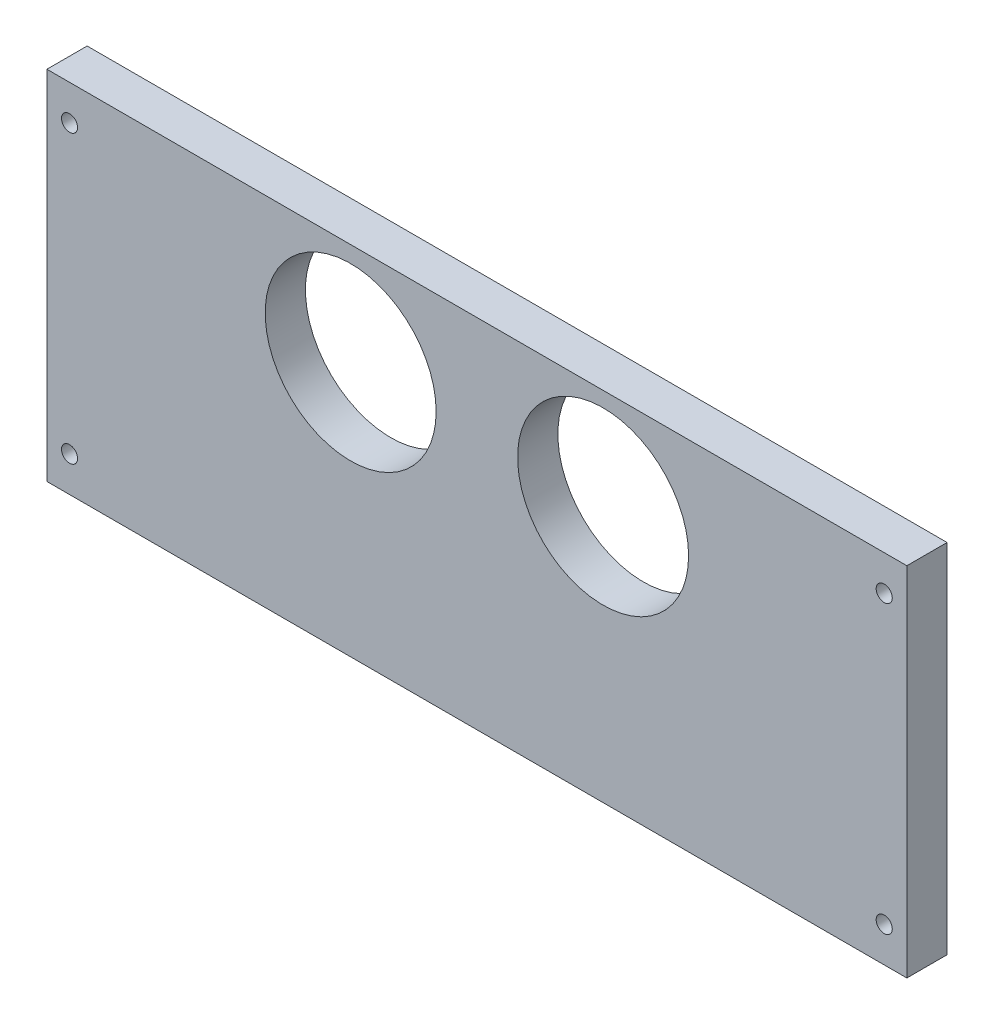
ISO-10303-21;
HEADER;
FILE_DESCRIPTION(('STEP AP214'),'2;1');
FILE_NAME('part.step','',(''),(''),'','','');
FILE_SCHEMA(('AUTOMOTIVE_DESIGN { 1 0 10303 214 1 1 1 1 }'));
ENDSEC;
DATA;
#1=APPLICATION_CONTEXT('core data for automotive mechanical design processes');
#2=APPLICATION_PROTOCOL_DEFINITION('international standard','automotive_design',2000,#1);
#3=PRODUCT_CONTEXT('',#1,'mechanical');
#4=PRODUCT('Part','Part','',(#3));
#5=PRODUCT_RELATED_PRODUCT_CATEGORY('part','',(#4));
#6=PRODUCT_DEFINITION_FORMATION('','',#4);
#7=PRODUCT_DEFINITION_CONTEXT('part definition',#1,'design');
#8=PRODUCT_DEFINITION('design','',#6,#7);
#9=PRODUCT_DEFINITION_SHAPE('','',#8);
#10=(LENGTH_UNIT() NAMED_UNIT(*) SI_UNIT(.MILLI.,.METRE.));
#11=(NAMED_UNIT(*) PLANE_ANGLE_UNIT() SI_UNIT($,.RADIAN.));
#12=(NAMED_UNIT(*) SI_UNIT($,.STERADIAN.) SOLID_ANGLE_UNIT());
#13=UNCERTAINTY_MEASURE_WITH_UNIT(LENGTH_MEASURE(1.E-05),#10,'distance_accuracy_value','');
#14=(GEOMETRIC_REPRESENTATION_CONTEXT(3) GLOBAL_UNCERTAINTY_ASSIGNED_CONTEXT((#13)) GLOBAL_UNIT_ASSIGNED_CONTEXT((#10,
#11,#12)) REPRESENTATION_CONTEXT('',''));
#15=CARTESIAN_POINT('',(0.,0.,0.));
#16=DIRECTION('',(0.,0.,1.));
#17=DIRECTION('',(1.,0.,0.));
#18=AXIS2_PLACEMENT_3D('',#15,#16,#17);
#19=CARTESIAN_POINT('',(42.75,17.75,-4.));
#20=DIRECTION('',(1.,0.,0.));
#21=DIRECTION('',(0.,0.,-1.));
#22=AXIS2_PLACEMENT_3D('',#19,#20,#21);
#23=PLANE('',#22);
#24=DIRECTION('',(0.,1.,0.));
#25=VECTOR('',#24,1.);
#26=CARTESIAN_POINT('',(42.75,17.75,0.));
#27=LINE('',#26,#25);
#28=CARTESIAN_POINT('',(42.75,-17.75,0.));
#29=VERTEX_POINT('',#28);
#30=CARTESIAN_POINT('',(42.75,17.75,0.));
#31=VERTEX_POINT('',#30);
#32=EDGE_CURVE('E126',#29,#31,#27,.T.);
#33=ORIENTED_EDGE('',*,*,#32,.F.);
#34=DIRECTION('',(0.,0.,1.));
#35=VECTOR('',#34,1.);
#36=CARTESIAN_POINT('',(42.75,-17.75,-4.));
#37=LINE('',#36,#35);
#38=CARTESIAN_POINT('',(42.75,-17.75,-4.));
#39=VERTEX_POINT('',#38);
#40=EDGE_CURVE('E11',#39,#29,#37,.T.);
#41=ORIENTED_EDGE('',*,*,#40,.F.);
#42=DIRECTION('',(0.,1.,0.));
#43=VECTOR('',#42,1.);
#44=CARTESIAN_POINT('',(42.75,17.75,-4.));
#45=LINE('',#44,#43);
#46=CARTESIAN_POINT('',(42.75,17.75,-4.));
#47=VERTEX_POINT('',#46);
#48=EDGE_CURVE('E117',#39,#47,#45,.T.);
#49=ORIENTED_EDGE('',*,*,#48,.T.);
#50=DIRECTION('',(0.,0.,1.));
#51=VECTOR('',#50,1.);
#52=CARTESIAN_POINT('',(42.75,17.75,-4.));
#53=LINE('',#52,#51);
#54=EDGE_CURVE('E97',#47,#31,#53,.T.);
#55=ORIENTED_EDGE('',*,*,#54,.T.);
#56=EDGE_LOOP('',(#33,#41,#49,#55));
#57=FACE_BOUND('',#56,.T.);
#58=ADVANCED_FACE('F53',(#57),#23,.T.);
#59=CARTESIAN_POINT('',(-42.75,-17.75,-4.));
#60=DIRECTION('',(0.,-1.,0.));
#61=DIRECTION('',(0.,0.,-1.));
#62=AXIS2_PLACEMENT_3D('',#59,#60,#61);
#63=PLANE('',#62);
#64=DIRECTION('',(1.,0.,0.));
#65=VECTOR('',#64,1.);
#66=CARTESIAN_POINT('',(-42.75,-17.75,0.));
#67=LINE('',#66,#65);
#68=CARTESIAN_POINT('',(-42.75,-17.75,0.));
#69=VERTEX_POINT('',#68);
#70=EDGE_CURVE('E120',#69,#29,#67,.T.);
#71=ORIENTED_EDGE('',*,*,#70,.F.);
#72=DIRECTION('',(0.,0.,1.));
#73=VECTOR('',#72,1.);
#74=CARTESIAN_POINT('',(-42.75,-17.75,-4.));
#75=LINE('',#74,#73);
#76=CARTESIAN_POINT('',(-42.75,-17.75,-4.));
#77=VERTEX_POINT('',#76);
#78=EDGE_CURVE('E63',#77,#69,#75,.T.);
#79=ORIENTED_EDGE('',*,*,#78,.F.);
#80=DIRECTION('',(1.,0.,0.));
#81=VECTOR('',#80,1.);
#82=CARTESIAN_POINT('',(-42.75,-17.75,-4.));
#83=LINE('',#82,#81);
#84=EDGE_CURVE('E112',#77,#39,#83,.T.);
#85=ORIENTED_EDGE('',*,*,#84,.T.);
#86=ORIENTED_EDGE('',*,*,#40,.T.);
#87=EDGE_LOOP('',(#71,#79,#85,#86));
#88=FACE_BOUND('',#87,.T.);
#89=ADVANCED_FACE('F143',(#88),#63,.T.);
#90=CARTESIAN_POINT('',(-42.75,17.75,-4.));
#91=DIRECTION('',(-1.,0.,0.));
#92=DIRECTION('',(0.,-1.,0.));
#93=AXIS2_PLACEMENT_3D('',#90,#91,#92);
#94=PLANE('',#93);
#95=DIRECTION('',(0.,-1.,0.));
#96=VECTOR('',#95,1.);
#97=CARTESIAN_POINT('',(-42.75,17.75,0.));
#98=LINE('',#97,#96);
#99=CARTESIAN_POINT('',(-42.75,17.75,0.));
#100=VERTEX_POINT('',#99);
#101=EDGE_CURVE('E105',#100,#69,#98,.T.);
#102=ORIENTED_EDGE('',*,*,#101,.F.);
#103=DIRECTION('',(0.,0.,1.));
#104=VECTOR('',#103,1.);
#105=CARTESIAN_POINT('',(-42.75,17.75,-4.));
#106=LINE('',#105,#104);
#107=CARTESIAN_POINT('',(-42.75,17.75,-4.));
#108=VERTEX_POINT('',#107);
#109=EDGE_CURVE('E100',#108,#100,#106,.T.);
#110=ORIENTED_EDGE('',*,*,#109,.F.);
#111=DIRECTION('',(0.,-1.,0.));
#112=VECTOR('',#111,1.);
#113=CARTESIAN_POINT('',(-42.75,17.75,-4.));
#114=LINE('',#113,#112);
#115=EDGE_CURVE('E103',#108,#77,#114,.T.);
#116=ORIENTED_EDGE('',*,*,#115,.T.);
#117=ORIENTED_EDGE('',*,*,#78,.T.);
#118=EDGE_LOOP('',(#102,#110,#116,#117));
#119=FACE_BOUND('',#118,.T.);
#120=ADVANCED_FACE('F102',(#119),#94,.T.);
#121=CARTESIAN_POINT('',(-42.75,17.75,-4.));
#122=DIRECTION('',(0.,1.,0.));
#123=DIRECTION('',(0.,0.,1.));
#124=AXIS2_PLACEMENT_3D('',#121,#122,#123);
#125=PLANE('',#124);
#126=DIRECTION('',(-1.,0.,0.));
#127=VECTOR('',#126,1.);
#128=CARTESIAN_POINT('',(-42.75,17.75,0.));
#129=LINE('',#128,#127);
#130=EDGE_CURVE('E130',#31,#100,#129,.T.);
#131=ORIENTED_EDGE('',*,*,#130,.F.);
#132=ORIENTED_EDGE('',*,*,#54,.F.);
#133=DIRECTION('',(-1.,0.,0.));
#134=VECTOR('',#133,1.);
#135=CARTESIAN_POINT('',(-42.75,17.75,-4.));
#136=LINE('',#135,#134);
#137=EDGE_CURVE('E111',#47,#108,#136,.T.);
#138=ORIENTED_EDGE('',*,*,#137,.T.);
#139=ORIENTED_EDGE('',*,*,#109,.T.);
#140=EDGE_LOOP('',(#131,#132,#138,#139));
#141=FACE_BOUND('',#140,.T.);
#142=ADVANCED_FACE('F115',(#141),#125,.T.);
#143=CARTESIAN_POINT('',(0.,0.,-4.));
#144=DIRECTION('',(0.,0.,1.));
#145=DIRECTION('',(1.,0.,0.));
#146=AXIS2_PLACEMENT_3D('',#143,#144,#145);
#147=PLANE('',#146);
#148=CARTESIAN_POINT('',(12.55,7.75000000000001,-4.));
#149=DIRECTION('',(0.,0.,1.));
#150=DIRECTION('',(1.,0.,0.));
#151=AXIS2_PLACEMENT_3D('',#148,#149,#150);
#152=CIRCLE('',#151,8.5);
#153=CARTESIAN_POINT('',(21.05,7.75000000000001,-4.));
#154=VERTEX_POINT('',#153);
#155=EDGE_CURVE('E197',#154,#154,#152,.T.);
#156=ORIENTED_EDGE('',*,*,#155,.T.);
#157=EDGE_LOOP('',(#156));
#158=FACE_BOUND('',#157,.T.);
#159=CARTESIAN_POINT('',(-12.55,7.61724702035248,-4.));
#160=DIRECTION('',(0.,0.,1.));
#161=DIRECTION('',(1.,0.,0.));
#162=AXIS2_PLACEMENT_3D('',#159,#160,#161);
#163=CIRCLE('',#162,8.5);
#164=CARTESIAN_POINT('',(-4.05,7.61724702035248,-4.));
#165=VERTEX_POINT('',#164);
#166=EDGE_CURVE('E200',#165,#165,#163,.T.);
#167=ORIENTED_EDGE('',*,*,#166,.T.);
#168=EDGE_LOOP('',(#167));
#169=FACE_BOUND('',#168,.T.);
#170=CARTESIAN_POINT('',(40.5,14.25,-4.));
#171=DIRECTION('',(0.,0.,1.));
#172=DIRECTION('',(1.,0.,0.));
#173=AXIS2_PLACEMENT_3D('',#170,#171,#172);
#174=CIRCLE('',#173,0.799999999999995);
#175=CARTESIAN_POINT('',(41.3,14.25,-4.));
#176=VERTEX_POINT('',#175);
#177=EDGE_CURVE('E205',#176,#176,#174,.T.);
#178=ORIENTED_EDGE('',*,*,#177,.T.);
#179=EDGE_LOOP('',(#178));
#180=FACE_BOUND('',#179,.T.);
#181=CARTESIAN_POINT('',(-40.5,14.25,-4.));
#182=DIRECTION('',(0.,0.,1.));
#183=DIRECTION('',(1.,0.,0.));
#184=AXIS2_PLACEMENT_3D('',#181,#182,#183);
#185=CIRCLE('',#184,0.799999999999995);
#186=CARTESIAN_POINT('',(-39.7,14.25,-4.));
#187=VERTEX_POINT('',#186);
#188=EDGE_CURVE('E218',#187,#187,#185,.T.);
#189=ORIENTED_EDGE('',*,*,#188,.T.);
#190=EDGE_LOOP('',(#189));
#191=FACE_BOUND('',#190,.T.);
#192=CARTESIAN_POINT('',(40.5,-14.25,-4.));
#193=DIRECTION('',(0.,0.,1.));
#194=DIRECTION('',(1.,0.,0.));
#195=AXIS2_PLACEMENT_3D('',#192,#193,#194);
#196=CIRCLE('',#195,0.799999999999995);
#197=CARTESIAN_POINT('',(41.3,-14.25,-4.));
#198=VERTEX_POINT('',#197);
#199=EDGE_CURVE('E56',#198,#198,#196,.T.);
#200=ORIENTED_EDGE('',*,*,#199,.T.);
#201=EDGE_LOOP('',(#200));
#202=FACE_BOUND('',#201,.T.);
#203=CARTESIAN_POINT('',(-40.5,-14.25,-4.));
#204=DIRECTION('',(0.,0.,1.));
#205=DIRECTION('',(1.,0.,0.));
#206=AXIS2_PLACEMENT_3D('',#203,#204,#205);
#207=CIRCLE('',#206,0.799999999999995);
#208=CARTESIAN_POINT('',(-39.7,-14.25,-4.));
#209=VERTEX_POINT('',#208);
#210=EDGE_CURVE('E131',#209,#209,#207,.T.);
#211=ORIENTED_EDGE('',*,*,#210,.T.);
#212=EDGE_LOOP('',(#211));
#213=FACE_BOUND('',#212,.T.);
#214=ORIENTED_EDGE('',*,*,#48,.F.);
#215=ORIENTED_EDGE('',*,*,#84,.F.);
#216=ORIENTED_EDGE('',*,*,#115,.F.);
#217=ORIENTED_EDGE('',*,*,#137,.F.);
#218=EDGE_LOOP('',(#214,#215,#216,#217));
#219=FACE_BOUND('',#218,.T.);
#220=ADVANCED_FACE('F110',(#158,#169,#180,#191,#202,#213,#219),#147,.F.);
#221=CARTESIAN_POINT('',(0.,0.,0.));
#222=DIRECTION('',(0.,0.,1.));
#223=DIRECTION('',(1.,0.,0.));
#224=AXIS2_PLACEMENT_3D('',#221,#222,#223);
#225=PLANE('',#224);
#226=CARTESIAN_POINT('',(12.55,7.75000000000001,0.));
#227=DIRECTION('',(0.,0.,1.));
#228=DIRECTION('',(1.,0.,0.));
#229=AXIS2_PLACEMENT_3D('',#226,#227,#228);
#230=CIRCLE('',#229,8.5);
#231=CARTESIAN_POINT('',(21.05,7.75000000000001,0.));
#232=VERTEX_POINT('',#231);
#233=EDGE_CURVE('E195',#232,#232,#230,.T.);
#234=ORIENTED_EDGE('',*,*,#233,.F.);
#235=EDGE_LOOP('',(#234));
#236=FACE_BOUND('',#235,.T.);
#237=CARTESIAN_POINT('',(-12.55,7.61724702035248,0.));
#238=DIRECTION('',(0.,0.,1.));
#239=DIRECTION('',(1.,0.,0.));
#240=AXIS2_PLACEMENT_3D('',#237,#238,#239);
#241=CIRCLE('',#240,8.5);
#242=CARTESIAN_POINT('',(-4.05,7.61724702035248,0.));
#243=VERTEX_POINT('',#242);
#244=EDGE_CURVE('E251',#243,#243,#241,.T.);
#245=ORIENTED_EDGE('',*,*,#244,.F.);
#246=EDGE_LOOP('',(#245));
#247=FACE_BOUND('',#246,.T.);
#248=CARTESIAN_POINT('',(40.5,14.25,0.));
#249=DIRECTION('',(0.,0.,1.));
#250=DIRECTION('',(1.,0.,0.));
#251=AXIS2_PLACEMENT_3D('',#248,#249,#250);
#252=CIRCLE('',#251,0.799999999999988);
#253=CARTESIAN_POINT('',(41.3,14.25,0.));
#254=VERTEX_POINT('',#253);
#255=EDGE_CURVE('E199',#254,#254,#252,.T.);
#256=ORIENTED_EDGE('',*,*,#255,.F.);
#257=EDGE_LOOP('',(#256));
#258=FACE_BOUND('',#257,.T.);
#259=CARTESIAN_POINT('',(-40.5,14.25,0.));
#260=DIRECTION('',(0.,0.,1.));
#261=DIRECTION('',(1.,0.,0.));
#262=AXIS2_PLACEMENT_3D('',#259,#260,#261);
#263=CIRCLE('',#262,0.799999999999988);
#264=CARTESIAN_POINT('',(-39.7,14.25,0.));
#265=VERTEX_POINT('',#264);
#266=EDGE_CURVE('E214',#265,#265,#263,.T.);
#267=ORIENTED_EDGE('',*,*,#266,.F.);
#268=EDGE_LOOP('',(#267));
#269=FACE_BOUND('',#268,.T.);
#270=CARTESIAN_POINT('',(40.5,-14.25,0.));
#271=DIRECTION('',(0.,0.,1.));
#272=DIRECTION('',(1.,0.,0.));
#273=AXIS2_PLACEMENT_3D('',#270,#271,#272);
#274=CIRCLE('',#273,0.799999999999988);
#275=CARTESIAN_POINT('',(41.3,-14.25,0.));
#276=VERTEX_POINT('',#275);
#277=EDGE_CURVE('E222',#276,#276,#274,.T.);
#278=ORIENTED_EDGE('',*,*,#277,.F.);
#279=EDGE_LOOP('',(#278));
#280=FACE_BOUND('',#279,.T.);
#281=CARTESIAN_POINT('',(-40.5,-14.25,0.));
#282=DIRECTION('',(0.,0.,1.));
#283=DIRECTION('',(1.,0.,0.));
#284=AXIS2_PLACEMENT_3D('',#281,#282,#283);
#285=CIRCLE('',#284,0.799999999999988);
#286=CARTESIAN_POINT('',(-39.7,-14.25,0.));
#287=VERTEX_POINT('',#286);
#288=EDGE_CURVE('E226',#287,#287,#285,.T.);
#289=ORIENTED_EDGE('',*,*,#288,.F.);
#290=EDGE_LOOP('',(#289));
#291=FACE_BOUND('',#290,.T.);
#292=ORIENTED_EDGE('',*,*,#32,.T.);
#293=ORIENTED_EDGE('',*,*,#130,.T.);
#294=ORIENTED_EDGE('',*,*,#101,.T.);
#295=ORIENTED_EDGE('',*,*,#70,.T.);
#296=EDGE_LOOP('',(#292,#293,#294,#295));
#297=FACE_BOUND('',#296,.T.);
#298=ADVANCED_FACE('F142',(#236,#247,#258,#269,#280,#291,#297),#225,.T.);
#299=CARTESIAN_POINT('',(-40.5,-14.25,0.));
#300=DIRECTION('',(0.,0.,1.));
#301=DIRECTION('',(1.,0.,0.));
#302=AXIS2_PLACEMENT_3D('',#299,#300,#301);
#303=CYLINDRICAL_SURFACE('',#302,0.799999999999995);
#304=ORIENTED_EDGE('',*,*,#288,.T.);
#305=EDGE_LOOP('',(#304));
#306=FACE_BOUND('',#305,.T.);
#307=ORIENTED_EDGE('',*,*,#210,.F.);
#308=EDGE_LOOP('',(#307));
#309=FACE_BOUND('',#308,.T.);
#310=ADVANCED_FACE('F163',(#306,#309),#303,.F.);
#311=CARTESIAN_POINT('',(40.5,-14.25,0.));
#312=DIRECTION('',(0.,0.,1.));
#313=DIRECTION('',(1.,0.,0.));
#314=AXIS2_PLACEMENT_3D('',#311,#312,#313);
#315=CYLINDRICAL_SURFACE('',#314,0.799999999999995);
#316=ORIENTED_EDGE('',*,*,#277,.T.);
#317=EDGE_LOOP('',(#316));
#318=FACE_BOUND('',#317,.T.);
#319=ORIENTED_EDGE('',*,*,#199,.F.);
#320=EDGE_LOOP('',(#319));
#321=FACE_BOUND('',#320,.T.);
#322=ADVANCED_FACE('F170',(#318,#321),#315,.F.);
#323=CARTESIAN_POINT('',(-40.5,14.25,0.));
#324=DIRECTION('',(0.,0.,1.));
#325=DIRECTION('',(1.,0.,0.));
#326=AXIS2_PLACEMENT_3D('',#323,#324,#325);
#327=CYLINDRICAL_SURFACE('',#326,0.799999999999995);
#328=ORIENTED_EDGE('',*,*,#266,.T.);
#329=EDGE_LOOP('',(#328));
#330=FACE_BOUND('',#329,.T.);
#331=ORIENTED_EDGE('',*,*,#188,.F.);
#332=EDGE_LOOP('',(#331));
#333=FACE_BOUND('',#332,.T.);
#334=ADVANCED_FACE('F174',(#330,#333),#327,.F.);
#335=CARTESIAN_POINT('',(40.5,14.25,0.));
#336=DIRECTION('',(0.,0.,1.));
#337=DIRECTION('',(1.,0.,0.));
#338=AXIS2_PLACEMENT_3D('',#335,#336,#337);
#339=CYLINDRICAL_SURFACE('',#338,0.799999999999995);
#340=ORIENTED_EDGE('',*,*,#255,.T.);
#341=EDGE_LOOP('',(#340));
#342=FACE_BOUND('',#341,.T.);
#343=ORIENTED_EDGE('',*,*,#177,.F.);
#344=EDGE_LOOP('',(#343));
#345=FACE_BOUND('',#344,.T.);
#346=ADVANCED_FACE('F178',(#342,#345),#339,.F.);
#347=CARTESIAN_POINT('',(-12.55,7.61724702035248,-10.));
#348=DIRECTION('',(0.,0.,1.));
#349=DIRECTION('',(1.,0.,0.));
#350=AXIS2_PLACEMENT_3D('',#347,#348,#349);
#351=CYLINDRICAL_SURFACE('',#350,8.5);
#352=ORIENTED_EDGE('',*,*,#244,.T.);
#353=EDGE_LOOP('',(#352));
#354=FACE_BOUND('',#353,.T.);
#355=ORIENTED_EDGE('',*,*,#166,.F.);
#356=EDGE_LOOP('',(#355));
#357=FACE_BOUND('',#356,.T.);
#358=ADVANCED_FACE('F182',(#354,#357),#351,.F.);
#359=CARTESIAN_POINT('',(12.55,7.75000000000001,-10.));
#360=DIRECTION('',(0.,0.,1.));
#361=DIRECTION('',(1.,0.,0.));
#362=AXIS2_PLACEMENT_3D('',#359,#360,#361);
#363=CYLINDRICAL_SURFACE('',#362,8.5);
#364=ORIENTED_EDGE('',*,*,#233,.T.);
#365=EDGE_LOOP('',(#364));
#366=FACE_BOUND('',#365,.T.);
#367=ORIENTED_EDGE('',*,*,#155,.F.);
#368=EDGE_LOOP('',(#367));
#369=FACE_BOUND('',#368,.T.);
#370=ADVANCED_FACE('F186',(#366,#369),#363,.F.);
#371=CLOSED_SHELL('',(#58,#89,#120,#142,#220,#298,#310,#322,#334,#346,#358,#370));
#372=MANIFOLD_SOLID_BREP('B2',#371);
#373=ADVANCED_BREP_SHAPE_REPRESENTATION('',(#18,#372),#14);
#374=SHAPE_DEFINITION_REPRESENTATION(#9,#373);
ENDSEC;
END-ISO-10303-21;
